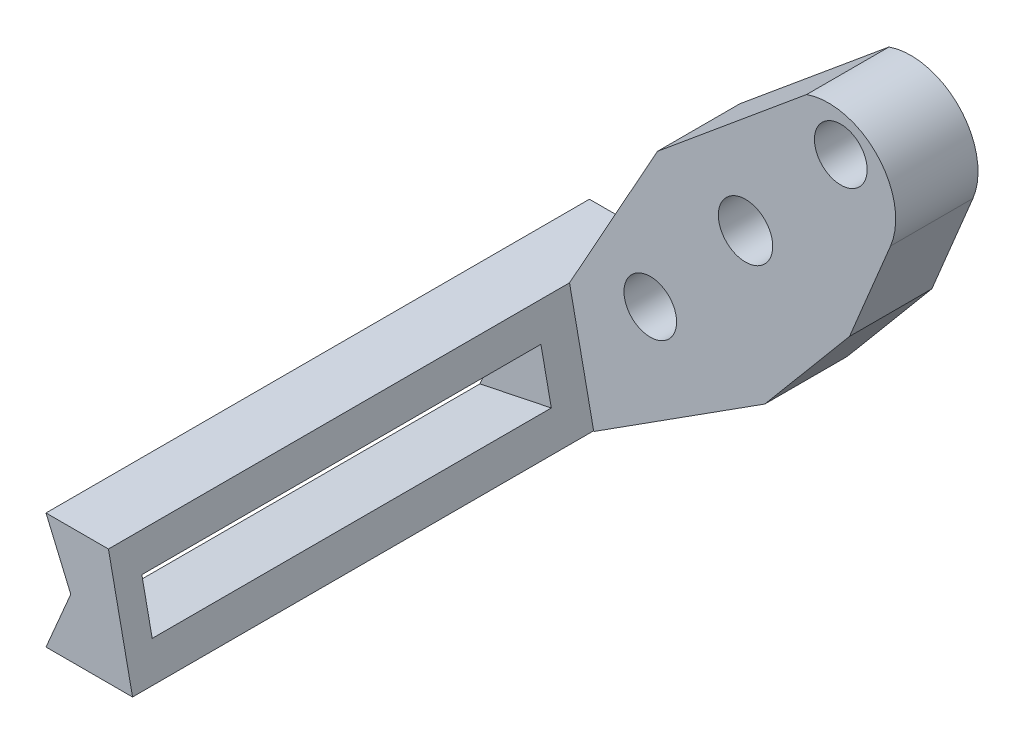
ISO-10303-21;
HEADER;
FILE_DESCRIPTION(('STEP AP214'),'2;1');
FILE_NAME('part.step','',(''),(''),'','','');
FILE_SCHEMA(('AUTOMOTIVE_DESIGN { 1 0 10303 214 1 1 1 1 }'));
ENDSEC;
DATA;
#1=APPLICATION_CONTEXT('core data for automotive mechanical design processes');
#2=APPLICATION_PROTOCOL_DEFINITION('international standard','automotive_design',2000,#1);
#3=PRODUCT_CONTEXT('',#1,'mechanical');
#4=PRODUCT('Part','Part','',(#3));
#5=PRODUCT_RELATED_PRODUCT_CATEGORY('part','',(#4));
#6=PRODUCT_DEFINITION_FORMATION('','',#4);
#7=PRODUCT_DEFINITION_CONTEXT('part definition',#1,'design');
#8=PRODUCT_DEFINITION('design','',#6,#7);
#9=PRODUCT_DEFINITION_SHAPE('','',#8);
#10=(LENGTH_UNIT() NAMED_UNIT(*) SI_UNIT(.MILLI.,.METRE.));
#11=(NAMED_UNIT(*) PLANE_ANGLE_UNIT() SI_UNIT($,.RADIAN.));
#12=(NAMED_UNIT(*) SI_UNIT($,.STERADIAN.) SOLID_ANGLE_UNIT());
#13=UNCERTAINTY_MEASURE_WITH_UNIT(LENGTH_MEASURE(1.E-05),#10,'distance_accuracy_value','');
#14=(GEOMETRIC_REPRESENTATION_CONTEXT(3) GLOBAL_UNCERTAINTY_ASSIGNED_CONTEXT((#13)) GLOBAL_UNIT_ASSIGNED_CONTEXT((#10,
#11,#12)) REPRESENTATION_CONTEXT('',''));
#15=CARTESIAN_POINT('',(0.,0.,0.));
#16=DIRECTION('',(0.,0.,1.));
#17=DIRECTION('',(1.,0.,0.));
#18=AXIS2_PLACEMENT_3D('',#15,#16,#17);
#19=CARTESIAN_POINT('',(-2.82502673300388,40.6543424730259,5.));
#20=DIRECTION('',(0.,0.,1.));
#21=DIRECTION('',(1.,0.,0.));
#22=AXIS2_PLACEMENT_3D('',#19,#20,#21);
#23=PLANE('',#22);
#24=DIRECTION('',(-0.203227090804288,0.97913163035581,0.));
#25=VECTOR('',#24,1.);
#26=CARTESIAN_POINT('',(-18.5531736225381,27.4082127288548,5.));
#27=LINE('',#26,#25);
#28=CARTESIAN_POINT('',(-17.089167091961,20.354748077747,5.));
#29=VERTEX_POINT('',#28);
#30=CARTESIAN_POINT('',(-18.5531736225381,27.4082127288548,5.));
#31=VERTEX_POINT('',#30);
#32=EDGE_CURVE('E215',#29,#31,#27,.T.);
#33=ORIENTED_EDGE('',*,*,#32,.F.);
#34=CARTESIAN_POINT('',(-15.1975545361622,23.8814804028788,5.));
#35=DIRECTION('',(0.,0.,1.));
#36=DIRECTION('',(1.,0.,0.));
#37=AXIS2_PLACEMENT_3D('',#34,#35,#36);
#38=CIRCLE('',#37,4.00200436711212);
#39=CARTESIAN_POINT('',(-17.0572612501405,20.3378198812756,5.));
#40=VERTEX_POINT('',#39);
#41=EDGE_CURVE('E282',#29,#40,#38,.T.);
#42=ORIENTED_EDGE('',*,*,#41,.T.);
#43=DIRECTION('',(0.842626394874636,0.538498615281946,0.));
#44=VECTOR('',#43,1.);
#45=CARTESIAN_POINT('',(-17.0572612501405,20.3378198812756,5.));
#46=LINE('',#45,#44);
#47=CARTESIAN_POINT('',(-6.69394680164964,26.9607200351142,5.));
#48=VERTEX_POINT('',#47);
#49=EDGE_CURVE('E285',#40,#48,#46,.T.);
#50=ORIENTED_EDGE('',*,*,#49,.T.);
#51=DIRECTION('',(0.642787609686522,0.766044443118993,0.));
#52=VECTOR('',#51,1.);
#53=CARTESIAN_POINT('',(-6.69394680164964,26.9607200351142,5.));
#54=LINE('',#53,#52);
#55=CARTESIAN_POINT('',(-1.55164567989795,33.0890758711633,5.));
#56=VERTEX_POINT('',#55);
#57=EDGE_CURVE('E288',#48,#56,#54,.T.);
#58=ORIENTED_EDGE('',*,*,#57,.T.);
#59=DIRECTION('',(0.383643938463096,0.92348109264918,0.));
#60=VECTOR('',#59,1.);
#61=CARTESIAN_POINT('',(-1.55164567989795,33.0890758711633,5.));
#62=LINE('',#61,#60);
#63=CARTESIAN_POINT('',(0.941217289791151,39.0897227947029,5.));
#64=VERTEX_POINT('',#63);
#65=EDGE_CURVE('E291',#56,#64,#62,.T.);
#66=ORIENTED_EDGE('',*,*,#65,.T.);
#67=CARTESIAN_POINT('',(-2.82502673300388,40.6543424730259,5.));
#68=DIRECTION('',(0.,0.,1.));
#69=DIRECTION('',(1.,0.,0.));
#70=AXIS2_PLACEMENT_3D('',#67,#68,#69);
#71=CIRCLE('',#70,4.07831200094291);
#72=CARTESIAN_POINT('',(-4.15352956225043,44.5102093028994,5.));
#73=VERTEX_POINT('',#72);
#74=EDGE_CURVE('E270',#64,#73,#71,.T.);
#75=ORIENTED_EDGE('',*,*,#74,.T.);
#76=DIRECTION('',(-0.769564202310093,-0.638569446906779,0.));
#77=VECTOR('',#76,1.);
#78=CARTESIAN_POINT('',(-13.2133597816465,36.9925379313588,5.));
#79=LINE('',#78,#77);
#80=CARTESIAN_POINT('',(-13.2133597816465,36.9925379313588,5.));
#81=VERTEX_POINT('',#80);
#82=EDGE_CURVE('E274',#73,#81,#79,.T.);
#83=ORIENTED_EDGE('',*,*,#82,.T.);
#84=DIRECTION('',(-0.486700455072757,-0.873568925175324,0.));
#85=VECTOR('',#84,1.);
#86=CARTESIAN_POINT('',(-13.2133597816465,36.9925379313588,5.));
#87=LINE('',#86,#85);
#88=EDGE_CURVE('E278',#81,#31,#87,.T.);
#89=ORIENTED_EDGE('',*,*,#88,.T.);
#90=EDGE_LOOP('',(#33,#42,#50,#58,#66,#75,#83,#89));
#91=FACE_BOUND('',#90,.T.);
#92=CARTESIAN_POINT('',(-7.86591892326885,35.491404278318,5.));
#93=DIRECTION('',(0.,0.,1.));
#94=DIRECTION('',(1.,0.,0.));
#95=AXIS2_PLACEMENT_3D('',#92,#93,#94);
#96=CIRCLE('',#95,1.65091884499999);
#97=CARTESIAN_POINT('',(-6.21500007826886,35.491404278318,5.));
#98=VERTEX_POINT('',#97);
#99=EDGE_CURVE('E254',#98,#98,#96,.T.);
#100=ORIENTED_EDGE('',*,*,#99,.F.);
#101=EDGE_LOOP('',(#100));
#102=FACE_BOUND('',#101,.T.);
#103=CARTESIAN_POINT('',(-2.08155607605558,42.3866025900172,5.));
#104=DIRECTION('',(0.,0.,1.));
#105=DIRECTION('',(1.,0.,0.));
#106=AXIS2_PLACEMENT_3D('',#103,#104,#105);
#107=CIRCLE('',#106,1.600993429);
#108=CARTESIAN_POINT('',(-0.480562647055581,42.3866025900172,5.));
#109=VERTEX_POINT('',#108);
#110=EDGE_CURVE('E262',#109,#109,#107,.T.);
#111=ORIENTED_EDGE('',*,*,#110,.F.);
#112=EDGE_LOOP('',(#111));
#113=FACE_BOUND('',#112,.T.);
#114=CARTESIAN_POINT('',(-13.6492327086376,28.5981606091439,5.));
#115=DIRECTION('',(0.,0.,1.));
#116=DIRECTION('',(1.,0.,0.));
#117=AXIS2_PLACEMENT_3D('',#114,#115,#116);
#118=CIRCLE('',#117,1.59816028100002);
#119=CARTESIAN_POINT('',(-12.0510724276376,28.5981606091439,5.));
#120=VERTEX_POINT('',#119);
#121=EDGE_CURVE('E246',#120,#120,#118,.T.);
#122=ORIENTED_EDGE('',*,*,#121,.F.);
#123=EDGE_LOOP('',(#122));
#124=FACE_BOUND('',#123,.T.);
#125=ADVANCED_FACE('F39',(#91,#102,#113,#124),#23,.T.);
#126=CARTESIAN_POINT('',(-2.82502673300388,40.6543424730259,0.));
#127=DIRECTION('',(0.,0.,1.));
#128=DIRECTION('',(1.,0.,0.));
#129=AXIS2_PLACEMENT_3D('',#126,#127,#128);
#130=PLANE('',#129);
#131=CARTESIAN_POINT('',(-2.82502673300388,40.6543424730259,0.));
#132=DIRECTION('',(0.,0.,1.));
#133=DIRECTION('',(1.,0.,0.));
#134=AXIS2_PLACEMENT_3D('',#131,#132,#133);
#135=CIRCLE('',#134,4.07831200094291);
#136=CARTESIAN_POINT('',(0.941217289791151,39.0897227947029,0.));
#137=VERTEX_POINT('',#136);
#138=CARTESIAN_POINT('',(-4.15352956225043,44.5102093028994,0.));
#139=VERTEX_POINT('',#138);
#140=EDGE_CURVE('E266',#137,#139,#135,.T.);
#141=ORIENTED_EDGE('',*,*,#140,.F.);
#142=DIRECTION('',(0.383643938463096,0.92348109264918,0.));
#143=VECTOR('',#142,1.);
#144=CARTESIAN_POINT('',(-1.55164567989795,33.0890758711633,0.));
#145=LINE('',#144,#143);
#146=CARTESIAN_POINT('',(-1.55164567989795,33.0890758711633,0.));
#147=VERTEX_POINT('',#146);
#148=EDGE_CURVE('E275',#147,#137,#145,.T.);
#149=ORIENTED_EDGE('',*,*,#148,.F.);
#150=DIRECTION('',(0.642787609686522,0.766044443118993,0.));
#151=VECTOR('',#150,1.);
#152=CARTESIAN_POINT('',(-6.69394680164964,26.9607200351142,0.));
#153=LINE('',#152,#151);
#154=CARTESIAN_POINT('',(-6.69394680164964,26.9607200351142,0.));
#155=VERTEX_POINT('',#154);
#156=EDGE_CURVE('E325',#155,#147,#153,.T.);
#157=ORIENTED_EDGE('',*,*,#156,.F.);
#158=DIRECTION('',(0.842626394874636,0.538498615281946,0.));
#159=VECTOR('',#158,1.);
#160=CARTESIAN_POINT('',(-17.0572612501405,20.3378198812756,0.));
#161=LINE('',#160,#159);
#162=CARTESIAN_POINT('',(-17.0572612501405,20.3378198812756,0.));
#163=VERTEX_POINT('',#162);
#164=EDGE_CURVE('E322',#163,#155,#161,.T.);
#165=ORIENTED_EDGE('',*,*,#164,.F.);
#166=CARTESIAN_POINT('',(-15.1975545361622,23.8814804028788,0.));
#167=DIRECTION('',(0.,0.,1.));
#168=DIRECTION('',(1.,0.,0.));
#169=AXIS2_PLACEMENT_3D('',#166,#167,#168);
#170=CIRCLE('',#169,4.00200436711212);
#171=CARTESIAN_POINT('',(-17.089167091961,20.354748077747,0.));
#172=VERTEX_POINT('',#171);
#173=EDGE_CURVE('E319',#172,#163,#170,.T.);
#174=ORIENTED_EDGE('',*,*,#173,.F.);
#175=DIRECTION('',(1.,0.,0.));
#176=VECTOR('',#175,1.);
#177=CARTESIAN_POINT('',(-19.8137268855852,20.354748077747,0.));
#178=LINE('',#177,#176);
#179=CARTESIAN_POINT('',(-22.3447490785681,20.354748077747,0.));
#180=VERTEX_POINT('',#179);
#181=EDGE_CURVE('E316',#180,#172,#178,.T.);
#182=ORIENTED_EDGE('',*,*,#181,.F.);
#183=DIRECTION('',(-0.392011700584297,-0.919960230990997,0.));
#184=VECTOR('',#183,1.);
#185=CARTESIAN_POINT('',(-20.8419446204268,23.8814804033009,0.));
#186=LINE('',#185,#184);
#187=CARTESIAN_POINT('',(-20.8419446204268,23.8814804033009,0.));
#188=VERTEX_POINT('',#187);
#189=EDGE_CURVE('E312',#188,#180,#186,.T.);
#190=ORIENTED_EDGE('',*,*,#189,.F.);
#191=DIRECTION('',(0.392011700584297,-0.919960230990997,0.));
#192=VECTOR('',#191,1.);
#193=CARTESIAN_POINT('',(-22.3447490785681,27.4082127288548,0.));
#194=LINE('',#193,#192);
#195=CARTESIAN_POINT('',(-22.3447490785681,27.4082127288548,0.));
#196=VERTEX_POINT('',#195);
#197=EDGE_CURVE('E308',#196,#188,#194,.T.);
#198=ORIENTED_EDGE('',*,*,#197,.F.);
#199=DIRECTION('',(-1.,0.,0.));
#200=VECTOR('',#199,1.);
#201=CARTESIAN_POINT('',(-19.8137268855852,27.4082127288548,0.));
#202=LINE('',#201,#200);
#203=CARTESIAN_POINT('',(-18.5531736225381,27.4082127288548,0.));
#204=VERTEX_POINT('',#203);
#205=EDGE_CURVE('E305',#204,#196,#202,.T.);
#206=ORIENTED_EDGE('',*,*,#205,.F.);
#207=DIRECTION('',(-0.486700455072757,-0.873568925175324,0.));
#208=VECTOR('',#207,1.);
#209=CARTESIAN_POINT('',(-13.2133597816465,36.9925379313588,0.));
#210=LINE('',#209,#208);
#211=CARTESIAN_POINT('',(-13.2133597816465,36.9925379313588,0.));
#212=VERTEX_POINT('',#211);
#213=EDGE_CURVE('E301',#212,#204,#210,.T.);
#214=ORIENTED_EDGE('',*,*,#213,.F.);
#215=DIRECTION('',(-0.769564202310093,-0.638569446906779,0.));
#216=VECTOR('',#215,1.);
#217=CARTESIAN_POINT('',(-13.2133597816465,36.9925379313588,0.));
#218=LINE('',#217,#216);
#219=EDGE_CURVE('E298',#139,#212,#218,.T.);
#220=ORIENTED_EDGE('',*,*,#219,.F.);
#221=EDGE_LOOP('',(#141,#149,#157,#165,#174,#182,#190,#198,#206,#214,#220));
#222=FACE_BOUND('',#221,.T.);
#223=CARTESIAN_POINT('',(-2.08155607605558,42.3866025900172,0.));
#224=DIRECTION('',(0.,0.,1.));
#225=DIRECTION('',(1.,0.,0.));
#226=AXIS2_PLACEMENT_3D('',#223,#224,#225);
#227=CIRCLE('',#226,1.600993429);
#228=CARTESIAN_POINT('',(-0.480562647055581,42.3866025900172,0.));
#229=VERTEX_POINT('',#228);
#230=EDGE_CURVE('E258',#229,#229,#227,.T.);
#231=ORIENTED_EDGE('',*,*,#230,.T.);
#232=EDGE_LOOP('',(#231));
#233=FACE_BOUND('',#232,.T.);
#234=CARTESIAN_POINT('',(-7.86591892326885,35.491404278318,0.));
#235=DIRECTION('',(0.,0.,1.));
#236=DIRECTION('',(1.,0.,0.));
#237=AXIS2_PLACEMENT_3D('',#234,#235,#236);
#238=CIRCLE('',#237,1.65091884499999);
#239=CARTESIAN_POINT('',(-6.21500007826886,35.491404278318,0.));
#240=VERTEX_POINT('',#239);
#241=EDGE_CURVE('E250',#240,#240,#238,.T.);
#242=ORIENTED_EDGE('',*,*,#241,.T.);
#243=EDGE_LOOP('',(#242));
#244=FACE_BOUND('',#243,.T.);
#245=CARTESIAN_POINT('',(-13.6492327086376,28.5981606091439,0.));
#246=DIRECTION('',(0.,0.,1.));
#247=DIRECTION('',(1.,0.,0.));
#248=AXIS2_PLACEMENT_3D('',#245,#246,#247);
#249=CIRCLE('',#248,1.59816028100002);
#250=CARTESIAN_POINT('',(-12.0510724276376,28.5981606091439,0.));
#251=VERTEX_POINT('',#250);
#252=EDGE_CURVE('E245',#251,#251,#249,.T.);
#253=ORIENTED_EDGE('',*,*,#252,.T.);
#254=EDGE_LOOP('',(#253));
#255=FACE_BOUND('',#254,.T.);
#256=ADVANCED_FACE('F375',(#222,#233,#244,#255),#130,.F.);
#257=CARTESIAN_POINT('',(-2.82502673300388,40.6543424730259,5.));
#258=DIRECTION('',(0.,0.,-1.));
#259=DIRECTION('',(-1.,0.,0.));
#260=AXIS2_PLACEMENT_3D('',#257,#258,#259);
#261=CYLINDRICAL_SURFACE('',#260,4.07831200094291);
#262=ORIENTED_EDGE('',*,*,#140,.T.);
#263=DIRECTION('',(0.,0.,-1.));
#264=VECTOR('',#263,1.);
#265=CARTESIAN_POINT('',(-4.15352956225043,44.5102093028994,5.));
#266=LINE('',#265,#264);
#267=EDGE_CURVE('E11',#73,#139,#266,.T.);
#268=ORIENTED_EDGE('',*,*,#267,.F.);
#269=ORIENTED_EDGE('',*,*,#74,.F.);
#270=DIRECTION('',(0.,0.,-1.));
#271=VECTOR('',#270,1.);
#272=CARTESIAN_POINT('',(0.941217289791151,39.0897227947029,5.));
#273=LINE('',#272,#271);
#274=EDGE_CURVE('E294',#64,#137,#273,.T.);
#275=ORIENTED_EDGE('',*,*,#274,.T.);
#276=EDGE_LOOP('',(#262,#268,#269,#275));
#277=FACE_BOUND('',#276,.T.);
#278=ADVANCED_FACE('F41',(#277),#261,.T.);
#279=CARTESIAN_POINT('',(-13.2133597816465,36.9925379313588,5.));
#280=DIRECTION('',(0.638569446906779,-0.769564202310093,0.));
#281=DIRECTION('',(0.769564202310094,0.638569446906779,0.));
#282=AXIS2_PLACEMENT_3D('',#279,#280,#281);
#283=PLANE('',#282);
#284=ORIENTED_EDGE('',*,*,#219,.T.);
#285=DIRECTION('',(0.,0.,-1.));
#286=VECTOR('',#285,1.);
#287=CARTESIAN_POINT('',(-13.2133597816465,36.9925379313588,5.));
#288=LINE('',#287,#286);
#289=EDGE_CURVE('E48',#81,#212,#288,.T.);
#290=ORIENTED_EDGE('',*,*,#289,.F.);
#291=ORIENTED_EDGE('',*,*,#82,.F.);
#292=ORIENTED_EDGE('',*,*,#267,.T.);
#293=EDGE_LOOP('',(#284,#290,#291,#292));
#294=FACE_BOUND('',#293,.T.);
#295=ADVANCED_FACE('F423',(#294),#283,.F.);
#296=CARTESIAN_POINT('',(-13.2133597816465,36.9925379313588,5.));
#297=DIRECTION('',(0.873568925175324,-0.486700455072757,0.));
#298=DIRECTION('',(0.486700455072757,0.873568925175324,0.));
#299=AXIS2_PLACEMENT_3D('',#296,#297,#298);
#300=PLANE('',#299);
#301=ORIENTED_EDGE('',*,*,#213,.T.);
#302=DIRECTION('',(0.,0.,-1.));
#303=VECTOR('',#302,1.);
#304=CARTESIAN_POINT('',(-18.5531736225381,27.4082127288548,5.));
#305=LINE('',#304,#303);
#306=EDGE_CURVE('E362',#31,#204,#305,.T.);
#307=ORIENTED_EDGE('',*,*,#306,.F.);
#308=ORIENTED_EDGE('',*,*,#88,.F.);
#309=ORIENTED_EDGE('',*,*,#289,.T.);
#310=EDGE_LOOP('',(#301,#307,#308,#309));
#311=FACE_BOUND('',#310,.T.);
#312=ADVANCED_FACE('F371',(#311),#300,.F.);
#313=CARTESIAN_POINT('',(-19.8137268855852,27.4082127288548,5.));
#314=DIRECTION('',(0.,-1.,0.));
#315=DIRECTION('',(0.,0.,-1.));
#316=AXIS2_PLACEMENT_3D('',#313,#314,#315);
#317=PLANE('',#316);
#318=ORIENTED_EDGE('',*,*,#205,.T.);
#319=DIRECTION('',(0.,0.,-1.));
#320=VECTOR('',#319,1.);
#321=CARTESIAN_POINT('',(-22.3447490785681,27.4082127288548,5.));
#322=LINE('',#321,#320);
#323=CARTESIAN_POINT('',(-22.3447490785681,27.4082127288548,33.));
#324=VERTEX_POINT('',#323);
#325=EDGE_CURVE('E358',#324,#196,#322,.T.);
#326=ORIENTED_EDGE('',*,*,#325,.F.);
#327=DIRECTION('',(-1.,0.,0.));
#328=VECTOR('',#327,1.);
#329=CARTESIAN_POINT('',(-18.5531736225381,27.4082127288548,33.));
#330=LINE('',#329,#328);
#331=CARTESIAN_POINT('',(-18.5531736225381,27.4082127288548,33.));
#332=VERTEX_POINT('',#331);
#333=EDGE_CURVE('E226',#332,#324,#330,.T.);
#334=ORIENTED_EDGE('',*,*,#333,.F.);
#335=DIRECTION('',(0.,0.,-1.));
#336=VECTOR('',#335,1.);
#337=CARTESIAN_POINT('',(-18.5531736225381,27.4082127288548,33.));
#338=LINE('',#337,#336);
#339=EDGE_CURVE('E234',#332,#31,#338,.T.);
#340=ORIENTED_EDGE('',*,*,#339,.T.);
#341=ORIENTED_EDGE('',*,*,#306,.T.);
#342=EDGE_LOOP('',(#318,#326,#334,#340,#341));
#343=FACE_BOUND('',#342,.T.);
#344=ADVANCED_FACE('F380',(#343),#317,.F.);
#345=CARTESIAN_POINT('',(-22.3447490785681,27.4082127288548,5.));
#346=DIRECTION('',(0.919960230990997,0.392011700584297,0.));
#347=DIRECTION('',(-0.392011700584297,0.919960230990997,0.));
#348=AXIS2_PLACEMENT_3D('',#345,#346,#347);
#349=PLANE('',#348);
#350=DIRECTION('',(0.,0.,-1.));
#351=VECTOR('',#350,1.);
#352=CARTESIAN_POINT('',(-20.8419446204268,23.8814804033009,5.));
#353=LINE('',#352,#351);
#354=CARTESIAN_POINT('',(-20.8419446204268,23.8814804033009,7.14356025779018));
#355=VERTEX_POINT('',#354);
#356=EDGE_CURVE('E353',#355,#188,#353,.T.);
#357=ORIENTED_EDGE('',*,*,#356,.F.);
#358=DIRECTION('',(-0.392011700584297,0.919960230990997,0.));
#359=VECTOR('',#358,1.);
#360=CARTESIAN_POINT('',(-22.3447490785681,27.4082127288548,7.14356025779018));
#361=LINE('',#360,#359);
#362=CARTESIAN_POINT('',(-21.2369812222578,24.8085393735528,7.14356025779018));
#363=VERTEX_POINT('',#362);
#364=EDGE_CURVE('E211',#355,#363,#361,.T.);
#365=ORIENTED_EDGE('',*,*,#364,.T.);
#366=DIRECTION('',(0.,0.,1.));
#367=VECTOR('',#366,1.);
#368=CARTESIAN_POINT('',(-21.2369812222578,24.8085393735528,5.));
#369=LINE('',#368,#367);
#370=CARTESIAN_POINT('',(-21.2369812222578,24.8085393735528,31.3782730326945));
#371=VERTEX_POINT('',#370);
#372=EDGE_CURVE('E190',#363,#371,#369,.T.);
#373=ORIENTED_EDGE('',*,*,#372,.T.);
#374=DIRECTION('',(0.392011700584297,-0.919960230990997,0.));
#375=VECTOR('',#374,1.);
#376=CARTESIAN_POINT('',(-22.3447490785681,27.4082127288548,31.3782730326945));
#377=LINE('',#376,#375);
#378=CARTESIAN_POINT('',(-20.8419446204268,23.8814804033009,31.3782730326945));
#379=VERTEX_POINT('',#378);
#380=EDGE_CURVE('E165',#371,#379,#377,.T.);
#381=ORIENTED_EDGE('',*,*,#380,.T.);
#382=CARTESIAN_POINT('',(-20.8419446204268,23.8814804033009,33.));
#383=VERTEX_POINT('',#382);
#384=EDGE_CURVE('E354',#383,#379,#353,.T.);
#385=ORIENTED_EDGE('',*,*,#384,.F.);
#386=DIRECTION('',(0.392011700584297,-0.919960230990997,0.));
#387=VECTOR('',#386,1.);
#388=CARTESIAN_POINT('',(-22.3447490785681,27.4082127288548,33.));
#389=LINE('',#388,#387);
#390=EDGE_CURVE('E230',#324,#383,#389,.T.);
#391=ORIENTED_EDGE('',*,*,#390,.F.);
#392=ORIENTED_EDGE('',*,*,#325,.T.);
#393=ORIENTED_EDGE('',*,*,#197,.T.);
#394=EDGE_LOOP('',(#357,#365,#373,#381,#385,#391,#392,#393));
#395=FACE_BOUND('',#394,.T.);
#396=ADVANCED_FACE('F385',(#395),#349,.F.);
#397=CARTESIAN_POINT('',(-20.8419446204268,23.8814804033009,5.));
#398=DIRECTION('',(0.919960230990997,-0.392011700584297,0.));
#399=DIRECTION('',(0.392011700584297,0.919960230990997,0.));
#400=AXIS2_PLACEMENT_3D('',#397,#398,#399);
#401=PLANE('',#400);
#402=DIRECTION('',(0.,0.,-1.));
#403=VECTOR('',#402,1.);
#404=CARTESIAN_POINT('',(-21.850270026589,21.5151753359154,5.));
#405=LINE('',#404,#403);
#406=CARTESIAN_POINT('',(-21.850270026589,21.5151753359154,31.3782730326945));
#407=VERTEX_POINT('',#406);
#408=CARTESIAN_POINT('',(-21.850270026589,21.5151753359154,7.14356025779018));
#409=VERTEX_POINT('',#408);
#410=EDGE_CURVE('E203',#407,#409,#405,.T.);
#411=ORIENTED_EDGE('',*,*,#410,.T.);
#412=DIRECTION('',(0.392011700584297,0.919960230990997,0.));
#413=VECTOR('',#412,1.);
#414=CARTESIAN_POINT('',(-20.8419446204268,23.8814804033009,7.14356025779018));
#415=LINE('',#414,#413);
#416=EDGE_CURVE('E207',#409,#355,#415,.T.);
#417=ORIENTED_EDGE('',*,*,#416,.T.);
#418=ORIENTED_EDGE('',*,*,#356,.T.);
#419=ORIENTED_EDGE('',*,*,#189,.T.);
#420=DIRECTION('',(0.,0.,-1.));
#421=VECTOR('',#420,1.);
#422=CARTESIAN_POINT('',(-22.3447490785681,20.354748077747,5.));
#423=LINE('',#422,#421);
#424=CARTESIAN_POINT('',(-22.3447490785681,20.354748077747,33.));
#425=VERTEX_POINT('',#424);
#426=EDGE_CURVE('E349',#425,#180,#423,.T.);
#427=ORIENTED_EDGE('',*,*,#426,.F.);
#428=DIRECTION('',(-0.392011700584297,-0.919960230990997,0.));
#429=VECTOR('',#428,1.);
#430=CARTESIAN_POINT('',(-20.8419446204268,23.8814804033009,33.));
#431=LINE('',#430,#429);
#432=EDGE_CURVE('E216',#383,#425,#431,.T.);
#433=ORIENTED_EDGE('',*,*,#432,.F.);
#434=ORIENTED_EDGE('',*,*,#384,.T.);
#435=DIRECTION('',(-0.392011700584297,-0.919960230990997,0.));
#436=VECTOR('',#435,1.);
#437=CARTESIAN_POINT('',(-20.8419446204268,23.8814804033009,31.3782730326945));
#438=LINE('',#437,#436);
#439=EDGE_CURVE('E197',#379,#407,#438,.T.);
#440=ORIENTED_EDGE('',*,*,#439,.T.);
#441=EDGE_LOOP('',(#411,#417,#418,#419,#427,#433,#434,#440));
#442=FACE_BOUND('',#441,.T.);
#443=ADVANCED_FACE('F390',(#442),#401,.F.);
#444=CARTESIAN_POINT('',(-19.8137268855852,20.354748077747,5.));
#445=DIRECTION('',(0.,1.,0.));
#446=DIRECTION('',(0.,0.,1.));
#447=AXIS2_PLACEMENT_3D('',#444,#445,#446);
#448=PLANE('',#447);
#449=ORIENTED_EDGE('',*,*,#181,.T.);
#450=DIRECTION('',(0.,0.,-1.));
#451=VECTOR('',#450,1.);
#452=CARTESIAN_POINT('',(-17.089167091961,20.354748077747,5.));
#453=LINE('',#452,#451);
#454=EDGE_CURVE('E345',#29,#172,#453,.T.);
#455=ORIENTED_EDGE('',*,*,#454,.F.);
#456=DIRECTION('',(0.,0.,-1.));
#457=VECTOR('',#456,1.);
#458=CARTESIAN_POINT('',(-17.089167091961,20.354748077747,33.));
#459=LINE('',#458,#457);
#460=CARTESIAN_POINT('',(-17.089167091961,20.354748077747,33.));
#461=VERTEX_POINT('',#460);
#462=EDGE_CURVE('E241',#461,#29,#459,.T.);
#463=ORIENTED_EDGE('',*,*,#462,.F.);
#464=DIRECTION('',(1.,0.,0.));
#465=VECTOR('',#464,1.);
#466=CARTESIAN_POINT('',(-22.3447490785681,20.354748077747,33.));
#467=LINE('',#466,#465);
#468=EDGE_CURVE('E220',#425,#461,#467,.T.);
#469=ORIENTED_EDGE('',*,*,#468,.F.);
#470=ORIENTED_EDGE('',*,*,#426,.T.);
#471=EDGE_LOOP('',(#449,#455,#463,#469,#470));
#472=FACE_BOUND('',#471,.T.);
#473=ADVANCED_FACE('F394',(#472),#448,.F.);
#474=CARTESIAN_POINT('',(-15.1975545361622,23.8814804028788,5.));
#475=DIRECTION('',(0.,0.,-1.));
#476=DIRECTION('',(-1.,0.,0.));
#477=AXIS2_PLACEMENT_3D('',#474,#475,#476);
#478=CYLINDRICAL_SURFACE('',#477,4.00200436711212);
#479=ORIENTED_EDGE('',*,*,#173,.T.);
#480=DIRECTION('',(0.,0.,-1.));
#481=VECTOR('',#480,1.);
#482=CARTESIAN_POINT('',(-17.0572612501405,20.3378198812756,5.));
#483=LINE('',#482,#481);
#484=EDGE_CURVE('E341',#40,#163,#483,.T.);
#485=ORIENTED_EDGE('',*,*,#484,.F.);
#486=ORIENTED_EDGE('',*,*,#41,.F.);
#487=ORIENTED_EDGE('',*,*,#454,.T.);
#488=EDGE_LOOP('',(#479,#485,#486,#487));
#489=FACE_BOUND('',#488,.T.);
#490=ADVANCED_FACE('F404',(#489),#478,.T.);
#491=CARTESIAN_POINT('',(-17.0572612501405,20.3378198812756,5.));
#492=DIRECTION('',(-0.538498615281947,0.842626394874636,0.));
#493=DIRECTION('',(-0.842626394874636,-0.538498615281947,0.));
#494=AXIS2_PLACEMENT_3D('',#491,#492,#493);
#495=PLANE('',#494);
#496=ORIENTED_EDGE('',*,*,#164,.T.);
#497=DIRECTION('',(0.,0.,-1.));
#498=VECTOR('',#497,1.);
#499=CARTESIAN_POINT('',(-6.69394680164964,26.9607200351142,5.));
#500=LINE('',#499,#498);
#501=EDGE_CURVE('E337',#48,#155,#500,.T.);
#502=ORIENTED_EDGE('',*,*,#501,.F.);
#503=ORIENTED_EDGE('',*,*,#49,.F.);
#504=ORIENTED_EDGE('',*,*,#484,.T.);
#505=EDGE_LOOP('',(#496,#502,#503,#504));
#506=FACE_BOUND('',#505,.T.);
#507=ADVANCED_FACE('F409',(#506),#495,.F.);
#508=CARTESIAN_POINT('',(-6.69394680164964,26.9607200351142,5.));
#509=DIRECTION('',(-0.766044443118993,0.642787609686522,0.));
#510=DIRECTION('',(-0.642787609686522,-0.766044443118993,0.));
#511=AXIS2_PLACEMENT_3D('',#508,#509,#510);
#512=PLANE('',#511);
#513=ORIENTED_EDGE('',*,*,#156,.T.);
#514=DIRECTION('',(0.,0.,-1.));
#515=VECTOR('',#514,1.);
#516=CARTESIAN_POINT('',(-1.55164567989795,33.0890758711633,5.));
#517=LINE('',#516,#515);
#518=EDGE_CURVE('E333',#56,#147,#517,.T.);
#519=ORIENTED_EDGE('',*,*,#518,.F.);
#520=ORIENTED_EDGE('',*,*,#57,.F.);
#521=ORIENTED_EDGE('',*,*,#501,.T.);
#522=EDGE_LOOP('',(#513,#519,#520,#521));
#523=FACE_BOUND('',#522,.T.);
#524=ADVANCED_FACE('F415',(#523),#512,.F.);
#525=CARTESIAN_POINT('',(-1.55164567989795,33.0890758711633,5.));
#526=DIRECTION('',(-0.923481092649181,0.383643938463096,0.));
#527=DIRECTION('',(-0.383643938463096,-0.923481092649181,0.));
#528=AXIS2_PLACEMENT_3D('',#525,#526,#527);
#529=PLANE('',#528);
#530=ORIENTED_EDGE('',*,*,#148,.T.);
#531=ORIENTED_EDGE('',*,*,#274,.F.);
#532=ORIENTED_EDGE('',*,*,#65,.F.);
#533=ORIENTED_EDGE('',*,*,#518,.T.);
#534=EDGE_LOOP('',(#530,#531,#532,#533));
#535=FACE_BOUND('',#534,.T.);
#536=ADVANCED_FACE('F419',(#535),#529,.F.);
#537=CARTESIAN_POINT('',(-2.08155607605558,42.3866025900172,5.));
#538=DIRECTION('',(0.,0.,-1.));
#539=DIRECTION('',(-1.,0.,0.));
#540=AXIS2_PLACEMENT_3D('',#537,#538,#539);
#541=CYLINDRICAL_SURFACE('',#540,1.600993429);
#542=ORIENTED_EDGE('',*,*,#110,.T.);
#543=EDGE_LOOP('',(#542));
#544=FACE_BOUND('',#543,.T.);
#545=ORIENTED_EDGE('',*,*,#230,.F.);
#546=EDGE_LOOP('',(#545));
#547=FACE_BOUND('',#546,.T.);
#548=ADVANCED_FACE('F437',(#544,#547),#541,.F.);
#549=CARTESIAN_POINT('',(-7.86591892326885,35.491404278318,5.));
#550=DIRECTION('',(0.,0.,-1.));
#551=DIRECTION('',(-1.,0.,0.));
#552=AXIS2_PLACEMENT_3D('',#549,#550,#551);
#553=CYLINDRICAL_SURFACE('',#552,1.65091884499999);
#554=ORIENTED_EDGE('',*,*,#99,.T.);
#555=EDGE_LOOP('',(#554));
#556=FACE_BOUND('',#555,.T.);
#557=ORIENTED_EDGE('',*,*,#241,.F.);
#558=EDGE_LOOP('',(#557));
#559=FACE_BOUND('',#558,.T.);
#560=ADVANCED_FACE('F495',(#556,#559),#553,.F.);
#561=CARTESIAN_POINT('',(-13.6492327086376,28.5981606091439,5.));
#562=DIRECTION('',(0.,0.,-1.));
#563=DIRECTION('',(-1.,0.,0.));
#564=AXIS2_PLACEMENT_3D('',#561,#562,#563);
#565=CYLINDRICAL_SURFACE('',#564,1.59816028100002);
#566=ORIENTED_EDGE('',*,*,#121,.T.);
#567=EDGE_LOOP('',(#566));
#568=FACE_BOUND('',#567,.T.);
#569=ORIENTED_EDGE('',*,*,#252,.F.);
#570=EDGE_LOOP('',(#569));
#571=FACE_BOUND('',#570,.T.);
#572=ADVANCED_FACE('F502',(#568,#571),#565,.F.);
#573=CARTESIAN_POINT('',(-18.5531736225381,27.4082127288548,33.));
#574=DIRECTION('',(-0.979131630355809,-0.203227090804288,0.));
#575=DIRECTION('',(0.203227090804288,-0.97913163035581,0.));
#576=AXIS2_PLACEMENT_3D('',#573,#574,#575);
#577=PLANE('',#576);
#578=DIRECTION('',(0.,0.,1.));
#579=VECTOR('',#578,1.);
#580=CARTESIAN_POINT('',(-18.1467194409295,25.4499494681432,7.14356025779018));
#581=LINE('',#580,#579);
#582=CARTESIAN_POINT('',(-18.1467194409295,25.4499494681432,7.14356025779019));
#583=VERTEX_POINT('',#582);
#584=CARTESIAN_POINT('',(-18.1467194409295,25.4499494681432,31.3782730326945));
#585=VERTEX_POINT('',#584);
#586=EDGE_CURVE('E172',#583,#585,#581,.T.);
#587=ORIENTED_EDGE('',*,*,#586,.F.);
#588=DIRECTION('',(-0.203227090804288,0.979131630355809,0.));
#589=VECTOR('',#588,1.);
#590=CARTESIAN_POINT('',(-18.1467194409295,25.4499494681432,7.14356025779018));
#591=LINE('',#590,#589);
#592=CARTESIAN_POINT('',(-17.5167154594362,22.4146414140402,7.14356025779018));
#593=VERTEX_POINT('',#592);
#594=EDGE_CURVE('E63',#593,#583,#591,.T.);
#595=ORIENTED_EDGE('',*,*,#594,.F.);
#596=DIRECTION('',(0.,0.,-1.));
#597=VECTOR('',#596,1.);
#598=CARTESIAN_POINT('',(-17.5167154594362,22.4146414140402,7.14356025779018));
#599=LINE('',#598,#597);
#600=CARTESIAN_POINT('',(-17.5167154594362,22.4146414140402,31.3782730326945));
#601=VERTEX_POINT('',#600);
#602=EDGE_CURVE('E180',#601,#593,#599,.T.);
#603=ORIENTED_EDGE('',*,*,#602,.F.);
#604=DIRECTION('',(0.203227090804288,-0.979131630355809,0.));
#605=VECTOR('',#604,1.);
#606=CARTESIAN_POINT('',(-18.1467194409295,25.4499494681432,31.3782730326945));
#607=LINE('',#606,#605);
#608=EDGE_CURVE('E162',#585,#601,#607,.T.);
#609=ORIENTED_EDGE('',*,*,#608,.F.);
#610=EDGE_LOOP('',(#587,#595,#603,#609));
#611=FACE_BOUND('',#610,.T.);
#612=ORIENTED_EDGE('',*,*,#32,.T.);
#613=ORIENTED_EDGE('',*,*,#339,.F.);
#614=DIRECTION('',(-0.203227090804288,0.97913163035581,0.));
#615=VECTOR('',#614,1.);
#616=CARTESIAN_POINT('',(-18.5531736225381,27.4082127288548,33.));
#617=LINE('',#616,#615);
#618=EDGE_CURVE('E223',#461,#332,#617,.T.);
#619=ORIENTED_EDGE('',*,*,#618,.F.);
#620=ORIENTED_EDGE('',*,*,#462,.T.);
#621=EDGE_LOOP('',(#612,#613,#619,#620));
#622=FACE_BOUND('',#621,.T.);
#623=ADVANCED_FACE('F177',(#611,#622),#577,.F.);
#624=CARTESIAN_POINT('',(0.,0.,33.));
#625=DIRECTION('',(0.,0.,1.));
#626=DIRECTION('',(1.,0.,0.));
#627=AXIS2_PLACEMENT_3D('',#624,#625,#626);
#628=PLANE('',#627);
#629=ORIENTED_EDGE('',*,*,#432,.T.);
#630=ORIENTED_EDGE('',*,*,#468,.T.);
#631=ORIENTED_EDGE('',*,*,#618,.T.);
#632=ORIENTED_EDGE('',*,*,#333,.T.);
#633=ORIENTED_EDGE('',*,*,#390,.T.);
#634=EDGE_LOOP('',(#629,#630,#631,#632,#633));
#635=FACE_BOUND('',#634,.T.);
#636=ADVANCED_FACE('F388',(#635),#628,.T.);
#637=CARTESIAN_POINT('',(-52.4163265033829,18.3370012899931,7.14356025779018));
#638=DIRECTION('',(0.,0.,-1.));
#639=DIRECTION('',(-1.,0.,0.));
#640=AXIS2_PLACEMENT_3D('',#637,#638,#639);
#641=PLANE('',#640);
#642=ORIENTED_EDGE('',*,*,#416,.F.);
#643=DIRECTION('',(0.97913163035581,0.203227090804288,0.));
#644=VECTOR('',#643,1.);
#645=CARTESIAN_POINT('',(-51.7863225218896,15.3016932358901,7.14356025779018));
#646=LINE('',#645,#644);
#647=EDGE_CURVE('E187',#409,#593,#646,.T.);
#648=ORIENTED_EDGE('',*,*,#647,.T.);
#649=ORIENTED_EDGE('',*,*,#594,.T.);
#650=DIRECTION('',(0.97913163035581,0.203227090804288,0.));
#651=VECTOR('',#650,1.);
#652=CARTESIAN_POINT('',(-52.4163265033829,18.3370012899931,7.14356025779018));
#653=LINE('',#652,#651);
#654=EDGE_CURVE('E169',#363,#583,#653,.T.);
#655=ORIENTED_EDGE('',*,*,#654,.F.);
#656=ORIENTED_EDGE('',*,*,#364,.F.);
#657=EDGE_LOOP('',(#642,#648,#649,#655,#656));
#658=FACE_BOUND('',#657,.T.);
#659=ADVANCED_FACE('F521',(#658),#641,.F.);
#660=CARTESIAN_POINT('',(-51.7863225218896,15.3016932358901,7.14356025779018));
#661=DIRECTION('',(0.203227090804288,-0.97913163035581,0.));
#662=DIRECTION('',(0.97913163035581,0.203227090804288,0.));
#663=AXIS2_PLACEMENT_3D('',#660,#661,#662);
#664=PLANE('',#663);
#665=DIRECTION('',(0.97913163035581,0.203227090804288,0.));
#666=VECTOR('',#665,1.);
#667=CARTESIAN_POINT('',(-51.7863225218896,15.3016932358901,31.3782730326945));
#668=LINE('',#667,#666);
#669=EDGE_CURVE('E55',#407,#601,#668,.T.);
#670=ORIENTED_EDGE('',*,*,#669,.T.);
#671=ORIENTED_EDGE('',*,*,#602,.T.);
#672=ORIENTED_EDGE('',*,*,#647,.F.);
#673=ORIENTED_EDGE('',*,*,#410,.F.);
#674=EDGE_LOOP('',(#670,#671,#672,#673));
#675=FACE_BOUND('',#674,.T.);
#676=ADVANCED_FACE('F527',(#675),#664,.F.);
#677=CARTESIAN_POINT('',(-52.4163265033829,18.3370012899931,31.3782730326945));
#678=DIRECTION('',(0.,0.,1.));
#679=DIRECTION('',(1.,0.,0.));
#680=AXIS2_PLACEMENT_3D('',#677,#678,#679);
#681=PLANE('',#680);
#682=DIRECTION('',(0.97913163035581,0.203227090804288,0.));
#683=VECTOR('',#682,1.);
#684=CARTESIAN_POINT('',(-52.4163265033829,18.3370012899931,31.3782730326945));
#685=LINE('',#684,#683);
#686=EDGE_CURVE('E158',#371,#585,#685,.T.);
#687=ORIENTED_EDGE('',*,*,#686,.T.);
#688=ORIENTED_EDGE('',*,*,#608,.T.);
#689=ORIENTED_EDGE('',*,*,#669,.F.);
#690=ORIENTED_EDGE('',*,*,#439,.F.);
#691=ORIENTED_EDGE('',*,*,#380,.F.);
#692=EDGE_LOOP('',(#687,#688,#689,#690,#691));
#693=FACE_BOUND('',#692,.T.);
#694=ADVANCED_FACE('F160',(#693),#681,.F.);
#695=CARTESIAN_POINT('',(-52.4163265033829,18.3370012899931,7.14356025779018));
#696=DIRECTION('',(-0.203227090804288,0.97913163035581,0.));
#697=DIRECTION('',(-0.97913163035581,-0.203227090804288,0.));
#698=AXIS2_PLACEMENT_3D('',#695,#696,#697);
#699=PLANE('',#698);
#700=ORIENTED_EDGE('',*,*,#654,.T.);
#701=ORIENTED_EDGE('',*,*,#586,.T.);
#702=ORIENTED_EDGE('',*,*,#686,.F.);
#703=ORIENTED_EDGE('',*,*,#372,.F.);
#704=EDGE_LOOP('',(#700,#701,#702,#703));
#705=FACE_BOUND('',#704,.T.);
#706=ADVANCED_FACE('F173',(#705),#699,.F.);
#707=CLOSED_SHELL('',(#125,#256,#278,#295,#312,#344,#396,#443,#473,#490,#507,#524,#536,#548,
#560,#572,#623,#636,#659,#676,#694,#706));
#708=MANIFOLD_SOLID_BREP('B2',#707);
#709=ADVANCED_BREP_SHAPE_REPRESENTATION('',(#18,#708),#14);
#710=SHAPE_DEFINITION_REPRESENTATION(#9,#709);
ENDSEC;
END-ISO-10303-21;
